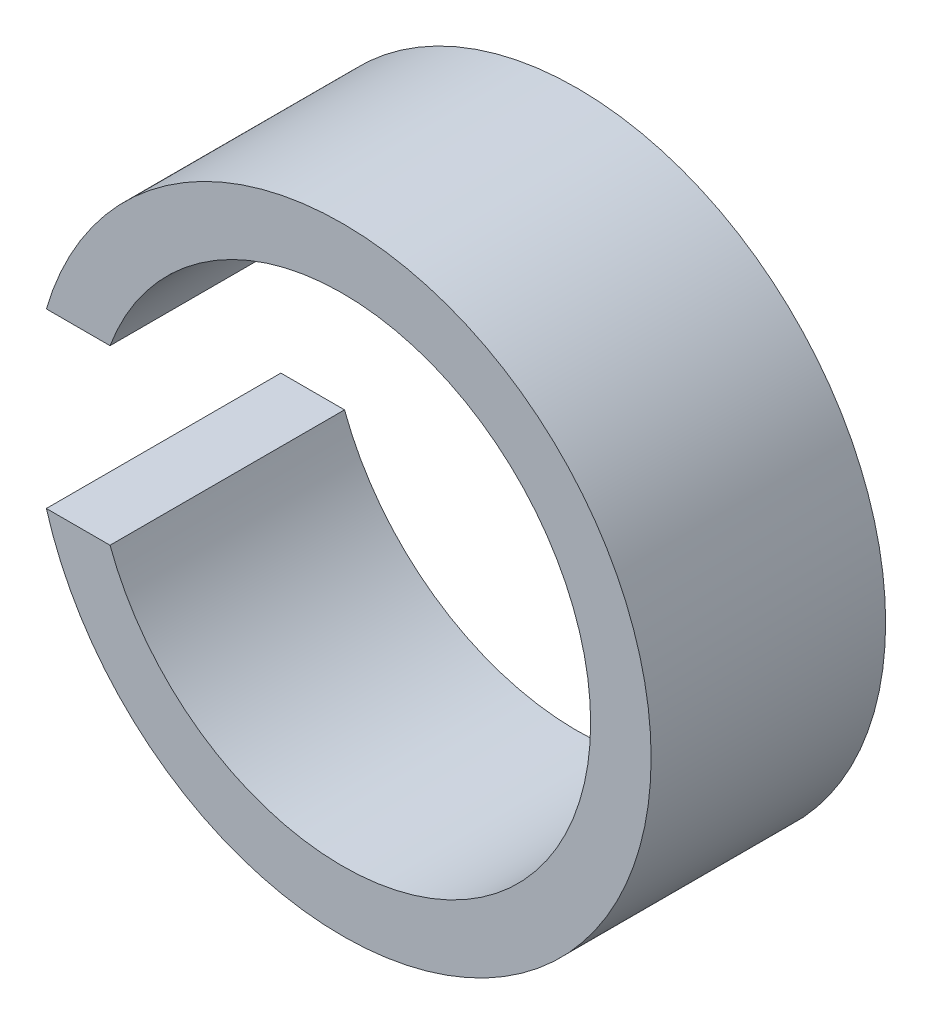
ISO-10303-21;
HEADER;
FILE_DESCRIPTION(('STEP AP214'),'2;1');
FILE_NAME('part.step','',(''),(''),'','','');
FILE_SCHEMA(('AUTOMOTIVE_DESIGN { 1 0 10303 214 1 1 1 1 }'));
ENDSEC;
DATA;
#1=APPLICATION_CONTEXT('core data for automotive mechanical design processes');
#2=APPLICATION_PROTOCOL_DEFINITION('international standard','automotive_design',2000,#1);
#3=PRODUCT_CONTEXT('',#1,'mechanical');
#4=PRODUCT('Part','Part','',(#3));
#5=PRODUCT_RELATED_PRODUCT_CATEGORY('part','',(#4));
#6=PRODUCT_DEFINITION_FORMATION('','',#4);
#7=PRODUCT_DEFINITION_CONTEXT('part definition',#1,'design');
#8=PRODUCT_DEFINITION('design','',#6,#7);
#9=PRODUCT_DEFINITION_SHAPE('','',#8);
#10=(LENGTH_UNIT() NAMED_UNIT(*) SI_UNIT(.MILLI.,.METRE.));
#11=(NAMED_UNIT(*) PLANE_ANGLE_UNIT() SI_UNIT($,.RADIAN.));
#12=(NAMED_UNIT(*) SI_UNIT($,.STERADIAN.) SOLID_ANGLE_UNIT());
#13=UNCERTAINTY_MEASURE_WITH_UNIT(LENGTH_MEASURE(1.E-05),#10,'distance_accuracy_value','');
#14=(GEOMETRIC_REPRESENTATION_CONTEXT(3) GLOBAL_UNCERTAINTY_ASSIGNED_CONTEXT((#13)) GLOBAL_UNIT_ASSIGNED_CONTEXT((#10,
#11,#12)) REPRESENTATION_CONTEXT('',''));
#15=CARTESIAN_POINT('',(0.,0.,0.));
#16=DIRECTION('',(0.,0.,1.));
#17=DIRECTION('',(1.,0.,0.));
#18=AXIS2_PLACEMENT_3D('',#15,#16,#17);
#19=CARTESIAN_POINT('',(0.,0.,19.));
#20=DIRECTION('',(0.,0.,1.));
#21=DIRECTION('',(1.,0.,0.));
#22=AXIS2_PLACEMENT_3D('',#19,#20,#21);
#23=PLANE('',#22);
#24=CARTESIAN_POINT('',(0.,0.,19.));
#25=DIRECTION('',(0.,0.,1.));
#26=DIRECTION('',(1.,0.,0.));
#27=AXIS2_PLACEMENT_3D('',#24,#25,#26);
#28=CIRCLE('',#27,20.1);
#29=CARTESIAN_POINT('',(-18.8417090519942,-7.,19.));
#30=VERTEX_POINT('',#29);
#31=CARTESIAN_POINT('',(-18.8417090519942,7.,19.));
#32=VERTEX_POINT('',#31);
#33=EDGE_CURVE('E83',#30,#32,#28,.T.);
#34=ORIENTED_EDGE('',*,*,#33,.F.);
#35=DIRECTION('',(-1.,0.,0.));
#36=VECTOR('',#35,1.);
#37=CARTESIAN_POINT('',(0.,-7.,19.));
#38=LINE('',#37,#36);
#39=CARTESIAN_POINT('',(-24.,-7.,19.));
#40=VERTEX_POINT('',#39);
#41=EDGE_CURVE('E57',#30,#40,#38,.T.);
#42=ORIENTED_EDGE('',*,*,#41,.T.);
#43=CARTESIAN_POINT('',(0.,0.,19.));
#44=DIRECTION('',(0.,0.,1.));
#45=DIRECTION('',(1.,0.,0.));
#46=AXIS2_PLACEMENT_3D('',#43,#44,#45);
#47=CIRCLE('',#46,25.);
#48=CARTESIAN_POINT('',(-24.,7.,19.));
#49=VERTEX_POINT('',#48);
#50=EDGE_CURVE('E79',#40,#49,#47,.T.);
#51=ORIENTED_EDGE('',*,*,#50,.T.);
#52=DIRECTION('',(-1.,0.,0.));
#53=VECTOR('',#52,1.);
#54=CARTESIAN_POINT('',(0.,7.,19.));
#55=LINE('',#54,#53);
#56=EDGE_CURVE('E73',#32,#49,#55,.T.);
#57=ORIENTED_EDGE('',*,*,#56,.F.);
#58=EDGE_LOOP('',(#34,#42,#51,#57));
#59=FACE_BOUND('',#58,.T.);
#60=ADVANCED_FACE('F34',(#59),#23,.T.);
#61=CARTESIAN_POINT('',(0.,0.,0.));
#62=DIRECTION('',(0.,0.,1.));
#63=DIRECTION('',(1.,0.,0.));
#64=AXIS2_PLACEMENT_3D('',#61,#62,#63);
#65=PLANE('',#64);
#66=DIRECTION('',(-1.,0.,0.));
#67=VECTOR('',#66,1.);
#68=CARTESIAN_POINT('',(0.,-7.,0.));
#69=LINE('',#68,#67);
#70=CARTESIAN_POINT('',(-18.8417090519942,-7.,0.));
#71=VERTEX_POINT('',#70);
#72=CARTESIAN_POINT('',(-24.,-7.,0.));
#73=VERTEX_POINT('',#72);
#74=EDGE_CURVE('E99',#71,#73,#69,.T.);
#75=ORIENTED_EDGE('',*,*,#74,.F.);
#76=CARTESIAN_POINT('',(0.,0.,0.));
#77=DIRECTION('',(0.,0.,1.));
#78=DIRECTION('',(1.,0.,0.));
#79=AXIS2_PLACEMENT_3D('',#76,#77,#78);
#80=CIRCLE('',#79,20.1);
#81=CARTESIAN_POINT('',(-18.8417090519942,7.,0.));
#82=VERTEX_POINT('',#81);
#83=EDGE_CURVE('E89',#71,#82,#80,.T.);
#84=ORIENTED_EDGE('',*,*,#83,.T.);
#85=DIRECTION('',(-1.,0.,0.));
#86=VECTOR('',#85,1.);
#87=CARTESIAN_POINT('',(0.,7.,0.));
#88=LINE('',#87,#86);
#89=CARTESIAN_POINT('',(-24.,7.,0.));
#90=VERTEX_POINT('',#89);
#91=EDGE_CURVE('E49',#82,#90,#88,.T.);
#92=ORIENTED_EDGE('',*,*,#91,.T.);
#93=CARTESIAN_POINT('',(0.,0.,0.));
#94=DIRECTION('',(0.,0.,1.));
#95=DIRECTION('',(1.,0.,0.));
#96=AXIS2_PLACEMENT_3D('',#93,#94,#95);
#97=CIRCLE('',#96,25.);
#98=EDGE_CURVE('E88',#73,#90,#97,.T.);
#99=ORIENTED_EDGE('',*,*,#98,.F.);
#100=EDGE_LOOP('',(#75,#84,#92,#99));
#101=FACE_BOUND('',#100,.T.);
#102=ADVANCED_FACE('F105',(#101),#65,.F.);
#103=CARTESIAN_POINT('',(0.,0.,19.));
#104=DIRECTION('',(0.,0.,-1.));
#105=DIRECTION('',(-1.,0.,0.));
#106=AXIS2_PLACEMENT_3D('',#103,#104,#105);
#107=CYLINDRICAL_SURFACE('',#106,25.);
#108=DIRECTION('',(0.,0.,-1.));
#109=VECTOR('',#108,1.);
#110=CARTESIAN_POINT('',(-24.,-7.,19.));
#111=LINE('',#110,#109);
#112=EDGE_CURVE('E93',#73,#40,#111,.F.);
#113=ORIENTED_EDGE('',*,*,#112,.F.);
#114=ORIENTED_EDGE('',*,*,#98,.T.);
#115=DIRECTION('',(0.,0.,-1.));
#116=VECTOR('',#115,1.);
#117=CARTESIAN_POINT('',(-24.,7.,19.));
#118=LINE('',#117,#116);
#119=EDGE_CURVE('E85',#90,#49,#118,.F.);
#120=ORIENTED_EDGE('',*,*,#119,.T.);
#121=ORIENTED_EDGE('',*,*,#50,.F.);
#122=EDGE_LOOP('',(#113,#114,#120,#121));
#123=FACE_BOUND('',#122,.T.);
#124=ADVANCED_FACE('F36',(#123),#107,.T.);
#125=CARTESIAN_POINT('',(0.,0.,19.));
#126=DIRECTION('',(0.,0.,-1.));
#127=DIRECTION('',(-1.,0.,0.));
#128=AXIS2_PLACEMENT_3D('',#125,#126,#127);
#129=CYLINDRICAL_SURFACE('',#128,20.1);
#130=ORIENTED_EDGE('',*,*,#83,.F.);
#131=DIRECTION('',(0.,0.,-1.));
#132=VECTOR('',#131,1.);
#133=CARTESIAN_POINT('',(-18.8417090519942,-7.,19.));
#134=LINE('',#133,#132);
#135=EDGE_CURVE('E11',#71,#30,#134,.F.);
#136=ORIENTED_EDGE('',*,*,#135,.T.);
#137=ORIENTED_EDGE('',*,*,#33,.T.);
#138=DIRECTION('',(0.,0.,-1.));
#139=VECTOR('',#138,1.);
#140=CARTESIAN_POINT('',(-18.8417090519942,7.,19.));
#141=LINE('',#140,#139);
#142=EDGE_CURVE('E42',#82,#32,#141,.F.);
#143=ORIENTED_EDGE('',*,*,#142,.F.);
#144=EDGE_LOOP('',(#130,#136,#137,#143));
#145=FACE_BOUND('',#144,.T.);
#146=ADVANCED_FACE('F87',(#145),#129,.F.);
#147=CARTESIAN_POINT('',(-4.45596527734438,7.,42.8227980373777));
#148=DIRECTION('',(0.,1.,0.));
#149=DIRECTION('',(0.,0.,1.));
#150=AXIS2_PLACEMENT_3D('',#147,#148,#149);
#151=PLANE('',#150);
#152=ORIENTED_EDGE('',*,*,#91,.F.);
#153=ORIENTED_EDGE('',*,*,#142,.T.);
#154=ORIENTED_EDGE('',*,*,#56,.T.);
#155=ORIENTED_EDGE('',*,*,#119,.F.);
#156=EDGE_LOOP('',(#152,#153,#154,#155));
#157=FACE_BOUND('',#156,.T.);
#158=ADVANCED_FACE('F72',(#157),#151,.F.);
#159=CARTESIAN_POINT('',(-4.45596527734438,-7.,42.8227980373777));
#160=DIRECTION('',(0.,1.,0.));
#161=DIRECTION('',(0.,0.,1.));
#162=AXIS2_PLACEMENT_3D('',#159,#160,#161);
#163=PLANE('',#162);
#164=ORIENTED_EDGE('',*,*,#112,.T.);
#165=ORIENTED_EDGE('',*,*,#41,.F.);
#166=ORIENTED_EDGE('',*,*,#135,.F.);
#167=ORIENTED_EDGE('',*,*,#74,.T.);
#168=EDGE_LOOP('',(#164,#165,#166,#167));
#169=FACE_BOUND('',#168,.T.);
#170=ADVANCED_FACE('F108',(#169),#163,.T.);
#171=CLOSED_SHELL('',(#60,#102,#124,#146,#158,#170));
#172=MANIFOLD_SOLID_BREP('B2',#171);
#173=ADVANCED_BREP_SHAPE_REPRESENTATION('',(#18,#172),#14);
#174=SHAPE_DEFINITION_REPRESENTATION(#9,#173);
ENDSEC;
END-ISO-10303-21;
